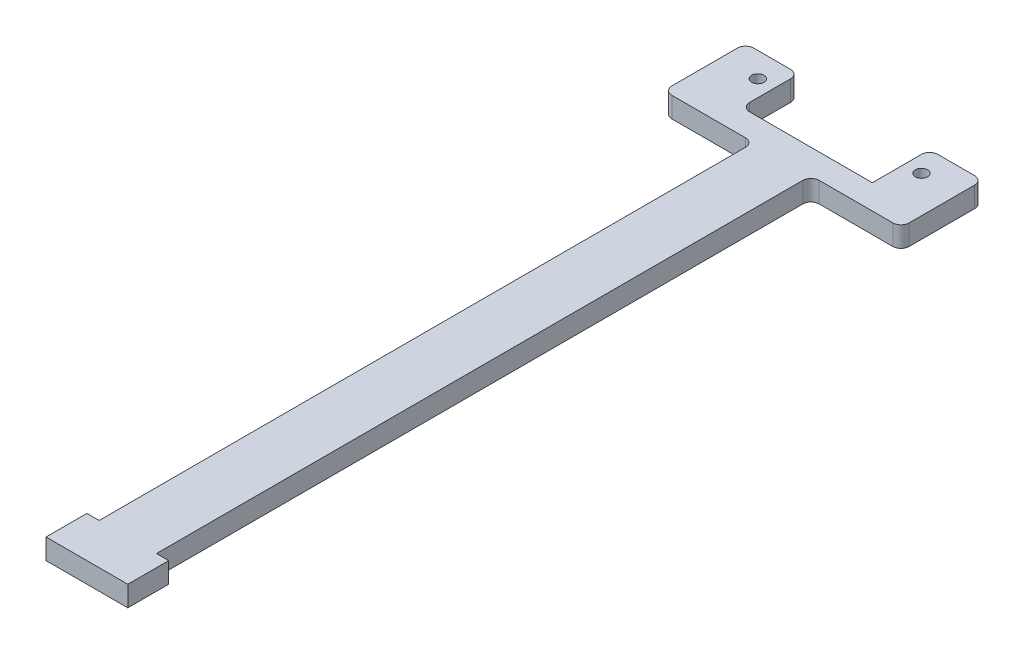
ISO-10303-21;
HEADER;
FILE_DESCRIPTION(('STEP AP214'),'2;1');
FILE_NAME('part.step','',(''),(''),'','','');
FILE_SCHEMA(('AUTOMOTIVE_DESIGN { 1 0 10303 214 1 1 1 1 }'));
ENDSEC;
DATA;
#1=APPLICATION_CONTEXT('core data for automotive mechanical design processes');
#2=APPLICATION_PROTOCOL_DEFINITION('international standard','automotive_design',2000,#1);
#3=PRODUCT_CONTEXT('',#1,'mechanical');
#4=PRODUCT('Part','Part','',(#3));
#5=PRODUCT_RELATED_PRODUCT_CATEGORY('part','',(#4));
#6=PRODUCT_DEFINITION_FORMATION('','',#4);
#7=PRODUCT_DEFINITION_CONTEXT('part definition',#1,'design');
#8=PRODUCT_DEFINITION('design','',#6,#7);
#9=PRODUCT_DEFINITION_SHAPE('','',#8);
#10=(LENGTH_UNIT() NAMED_UNIT(*) SI_UNIT(.MILLI.,.METRE.));
#11=(NAMED_UNIT(*) PLANE_ANGLE_UNIT() SI_UNIT($,.RADIAN.));
#12=(NAMED_UNIT(*) SI_UNIT($,.STERADIAN.) SOLID_ANGLE_UNIT());
#13=UNCERTAINTY_MEASURE_WITH_UNIT(LENGTH_MEASURE(1.E-05),#10,'distance_accuracy_value','');
#14=(GEOMETRIC_REPRESENTATION_CONTEXT(3) GLOBAL_UNCERTAINTY_ASSIGNED_CONTEXT((#13)) GLOBAL_UNIT_ASSIGNED_CONTEXT((#10,
#11,#12)) REPRESENTATION_CONTEXT('',''));
#15=CARTESIAN_POINT('',(0.,0.,0.));
#16=DIRECTION('',(0.,0.,1.));
#17=DIRECTION('',(1.,0.,0.));
#18=AXIS2_PLACEMENT_3D('',#15,#16,#17);
#19=CARTESIAN_POINT('',(28.,5.,-180.));
#20=DIRECTION('',(0.,0.,1.));
#21=DIRECTION('',(1.,0.,0.));
#22=AXIS2_PLACEMENT_3D('',#19,#20,#21);
#23=PLANE('',#22);
#24=DIRECTION('',(-1.,0.,0.));
#25=VECTOR('',#24,1.);
#26=CARTESIAN_POINT('',(28.,5.,-180.));
#27=LINE('',#26,#25);
#28=CARTESIAN_POINT('',(26.,5.,-180.));
#29=VERTEX_POINT('',#28);
#30=CARTESIAN_POINT('',(17.,5.,-180.));
#31=VERTEX_POINT('',#30);
#32=EDGE_CURVE('E264',#29,#31,#27,.T.);
#33=ORIENTED_EDGE('',*,*,#32,.F.);
#34=DIRECTION('',(0.,-1.,0.));
#35=VECTOR('',#34,1.);
#36=CARTESIAN_POINT('',(26.,5.,-180.));
#37=LINE('',#36,#35);
#38=CARTESIAN_POINT('',(26.,0.,-180.));
#39=VERTEX_POINT('',#38);
#40=EDGE_CURVE('E440',#29,#39,#37,.T.);
#41=ORIENTED_EDGE('',*,*,#40,.T.);
#42=DIRECTION('',(-1.,0.,0.));
#43=VECTOR('',#42,1.);
#44=CARTESIAN_POINT('',(28.,0.,-180.));
#45=LINE('',#44,#43);
#46=CARTESIAN_POINT('',(17.,0.,-180.));
#47=VERTEX_POINT('',#46);
#48=EDGE_CURVE('E311',#39,#47,#45,.T.);
#49=ORIENTED_EDGE('',*,*,#48,.T.);
#50=DIRECTION('',(0.,1.,0.));
#51=VECTOR('',#50,1.);
#52=CARTESIAN_POINT('',(17.,5.,-180.));
#53=LINE('',#52,#51);
#54=EDGE_CURVE('E437',#47,#31,#53,.T.);
#55=ORIENTED_EDGE('',*,*,#54,.T.);
#56=EDGE_LOOP('',(#33,#41,#49,#55));
#57=FACE_BOUND('',#56,.T.);
#58=ADVANCED_FACE('F39',(#57),#23,.F.);
#59=CARTESIAN_POINT('',(-11.,5.,10.));
#60=DIRECTION('',(0.,0.,-1.));
#61=DIRECTION('',(-1.,0.,0.));
#62=AXIS2_PLACEMENT_3D('',#59,#60,#61);
#63=PLANE('',#62);
#64=DIRECTION('',(1.,0.,0.));
#65=VECTOR('',#64,1.);
#66=CARTESIAN_POINT('',(-11.,0.,10.));
#67=LINE('',#66,#65);
#68=CARTESIAN_POINT('',(-11.,0.,10.));
#69=VERTEX_POINT('',#68);
#70=CARTESIAN_POINT('',(9.,0.,10.));
#71=VERTEX_POINT('',#70);
#72=EDGE_CURVE('E284',#69,#71,#67,.T.);
#73=ORIENTED_EDGE('',*,*,#72,.T.);
#74=DIRECTION('',(0.,-1.,0.));
#75=VECTOR('',#74,1.);
#76=CARTESIAN_POINT('',(9.,5.,10.));
#77=LINE('',#76,#75);
#78=CARTESIAN_POINT('',(9.,5.,10.));
#79=VERTEX_POINT('',#78);
#80=EDGE_CURVE('E347',#79,#71,#77,.T.);
#81=ORIENTED_EDGE('',*,*,#80,.F.);
#82=DIRECTION('',(1.,0.,0.));
#83=VECTOR('',#82,1.);
#84=CARTESIAN_POINT('',(-11.,5.,10.));
#85=LINE('',#84,#83);
#86=CARTESIAN_POINT('',(-11.,5.,10.));
#87=VERTEX_POINT('',#86);
#88=EDGE_CURVE('E241',#87,#79,#85,.T.);
#89=ORIENTED_EDGE('',*,*,#88,.F.);
#90=DIRECTION('',(0.,-1.,0.));
#91=VECTOR('',#90,1.);
#92=CARTESIAN_POINT('',(-11.,5.,10.));
#93=LINE('',#92,#91);
#94=EDGE_CURVE('E283',#87,#69,#93,.T.);
#95=ORIENTED_EDGE('',*,*,#94,.T.);
#96=EDGE_LOOP('',(#73,#81,#89,#95));
#97=FACE_BOUND('',#96,.T.);
#98=ADVANCED_FACE('F525',(#97),#63,.F.);
#99=CARTESIAN_POINT('',(9.,5.,10.));
#100=DIRECTION('',(-1.,0.,0.));
#101=DIRECTION('',(0.,0.,1.));
#102=AXIS2_PLACEMENT_3D('',#99,#100,#101);
#103=PLANE('',#102);
#104=DIRECTION('',(0.,0.,-1.));
#105=VECTOR('',#104,1.);
#106=CARTESIAN_POINT('',(9.,0.,10.));
#107=LINE('',#106,#105);
#108=CARTESIAN_POINT('',(9.,0.,0.));
#109=VERTEX_POINT('',#108);
#110=EDGE_CURVE('E288',#71,#109,#107,.T.);
#111=ORIENTED_EDGE('',*,*,#110,.T.);
#112=DIRECTION('',(0.,-1.,0.));
#113=VECTOR('',#112,1.);
#114=CARTESIAN_POINT('',(9.,5.,0.));
#115=LINE('',#114,#113);
#116=CARTESIAN_POINT('',(9.,5.,0.));
#117=VERTEX_POINT('',#116);
#118=EDGE_CURVE('E343',#117,#109,#115,.T.);
#119=ORIENTED_EDGE('',*,*,#118,.F.);
#120=DIRECTION('',(0.,0.,-1.));
#121=VECTOR('',#120,1.);
#122=CARTESIAN_POINT('',(9.,5.,10.));
#123=LINE('',#122,#121);
#124=EDGE_CURVE('E245',#79,#117,#123,.T.);
#125=ORIENTED_EDGE('',*,*,#124,.F.);
#126=ORIENTED_EDGE('',*,*,#80,.T.);
#127=EDGE_LOOP('',(#111,#119,#125,#126));
#128=FACE_BOUND('',#127,.T.);
#129=ADVANCED_FACE('F531',(#128),#103,.F.);
#130=CARTESIAN_POINT('',(9.,5.,0.));
#131=DIRECTION('',(0.,0.,1.));
#132=DIRECTION('',(1.,0.,0.));
#133=AXIS2_PLACEMENT_3D('',#130,#131,#132);
#134=PLANE('',#133);
#135=DIRECTION('',(-1.,0.,0.));
#136=VECTOR('',#135,1.);
#137=CARTESIAN_POINT('',(9.,0.,0.));
#138=LINE('',#137,#136);
#139=CARTESIAN_POINT('',(6.,0.,0.));
#140=VERTEX_POINT('',#139);
#141=EDGE_CURVE('E292',#109,#140,#138,.T.);
#142=ORIENTED_EDGE('',*,*,#141,.T.);
#143=DIRECTION('',(0.,-1.,0.));
#144=VECTOR('',#143,1.);
#145=CARTESIAN_POINT('',(6.,5.,0.));
#146=LINE('',#145,#144);
#147=CARTESIAN_POINT('',(6.,5.,0.));
#148=VERTEX_POINT('',#147);
#149=EDGE_CURVE('E339',#148,#140,#146,.T.);
#150=ORIENTED_EDGE('',*,*,#149,.F.);
#151=DIRECTION('',(-1.,0.,0.));
#152=VECTOR('',#151,1.);
#153=CARTESIAN_POINT('',(9.,5.,0.));
#154=LINE('',#153,#152);
#155=EDGE_CURVE('E249',#117,#148,#154,.T.);
#156=ORIENTED_EDGE('',*,*,#155,.F.);
#157=ORIENTED_EDGE('',*,*,#118,.T.);
#158=EDGE_LOOP('',(#142,#150,#156,#157));
#159=FACE_BOUND('',#158,.T.);
#160=ADVANCED_FACE('F557',(#159),#134,.F.);
#161=CARTESIAN_POINT('',(6.,5.,0.));
#162=DIRECTION('',(-1.,0.,0.));
#163=DIRECTION('',(0.,0.,1.));
#164=AXIS2_PLACEMENT_3D('',#161,#162,#163);
#165=PLANE('',#164);
#166=DIRECTION('',(0.,0.,-1.));
#167=VECTOR('',#166,1.);
#168=CARTESIAN_POINT('',(6.,0.,0.));
#169=LINE('',#168,#167);
#170=CARTESIAN_POINT('',(6.00000000000001,0.,-158.));
#171=VERTEX_POINT('',#170);
#172=EDGE_CURVE('E295',#140,#171,#169,.T.);
#173=ORIENTED_EDGE('',*,*,#172,.T.);
#174=DIRECTION('',(0.,-1.,0.));
#175=VECTOR('',#174,1.);
#176=CARTESIAN_POINT('',(6.00000000000001,5.,-158.));
#177=LINE('',#176,#175);
#178=CARTESIAN_POINT('',(6.00000000000001,5.,-158.));
#179=VERTEX_POINT('',#178);
#180=EDGE_CURVE('E375',#171,#179,#177,.F.);
#181=ORIENTED_EDGE('',*,*,#180,.T.);
#182=DIRECTION('',(0.,0.,-1.));
#183=VECTOR('',#182,1.);
#184=CARTESIAN_POINT('',(6.,5.,0.));
#185=LINE('',#184,#183);
#186=EDGE_CURVE('E252',#148,#179,#185,.T.);
#187=ORIENTED_EDGE('',*,*,#186,.F.);
#188=ORIENTED_EDGE('',*,*,#149,.T.);
#189=EDGE_LOOP('',(#173,#181,#187,#188));
#190=FACE_BOUND('',#189,.T.);
#191=ADVANCED_FACE('F550',(#190),#165,.F.);
#192=CARTESIAN_POINT('',(6.00000000000001,5.,-160.));
#193=DIRECTION('',(0.,0.,-1.));
#194=DIRECTION('',(-1.,0.,0.));
#195=AXIS2_PLACEMENT_3D('',#192,#193,#194);
#196=PLANE('',#195);
#197=DIRECTION('',(1.,0.,0.));
#198=VECTOR('',#197,1.);
#199=CARTESIAN_POINT('',(6.00000000000001,5.,-160.));
#200=LINE('',#199,#198);
#201=CARTESIAN_POINT('',(8.00000000000001,5.,-160.));
#202=VERTEX_POINT('',#201);
#203=CARTESIAN_POINT('',(26.,5.,-160.));
#204=VERTEX_POINT('',#203);
#205=EDGE_CURVE('E256',#202,#204,#200,.T.);
#206=ORIENTED_EDGE('',*,*,#205,.F.);
#207=DIRECTION('',(0.,-1.,0.));
#208=VECTOR('',#207,1.);
#209=CARTESIAN_POINT('',(8.00000000000001,0.,-160.));
#210=LINE('',#209,#208);
#211=CARTESIAN_POINT('',(8.00000000000001,0.,-160.));
#212=VERTEX_POINT('',#211);
#213=EDGE_CURVE('E371',#202,#212,#210,.T.);
#214=ORIENTED_EDGE('',*,*,#213,.T.);
#215=DIRECTION('',(1.,0.,0.));
#216=VECTOR('',#215,1.);
#217=CARTESIAN_POINT('',(6.00000000000001,0.,-160.));
#218=LINE('',#217,#216);
#219=CARTESIAN_POINT('',(26.,0.,-160.));
#220=VERTEX_POINT('',#219);
#221=EDGE_CURVE('E299',#212,#220,#218,.T.);
#222=ORIENTED_EDGE('',*,*,#221,.T.);
#223=DIRECTION('',(0.,-1.,0.));
#224=VECTOR('',#223,1.);
#225=CARTESIAN_POINT('',(26.,5.,-160.));
#226=LINE('',#225,#224);
#227=EDGE_CURVE('E360',#220,#204,#226,.F.);
#228=ORIENTED_EDGE('',*,*,#227,.T.);
#229=EDGE_LOOP('',(#206,#214,#222,#228));
#230=FACE_BOUND('',#229,.T.);
#231=ADVANCED_FACE('F545',(#230),#196,.F.);
#232=CARTESIAN_POINT('',(28.,5.,-160.));
#233=DIRECTION('',(-1.,0.,0.));
#234=DIRECTION('',(0.,0.,1.));
#235=AXIS2_PLACEMENT_3D('',#232,#233,#234);
#236=PLANE('',#235);
#237=DIRECTION('',(0.,0.,-1.));
#238=VECTOR('',#237,1.);
#239=CARTESIAN_POINT('',(28.,5.,-160.));
#240=LINE('',#239,#238);
#241=CARTESIAN_POINT('',(28.,5.,-162.));
#242=VERTEX_POINT('',#241);
#243=CARTESIAN_POINT('',(28.,5.,-178.));
#244=VERTEX_POINT('',#243);
#245=EDGE_CURVE('E260',#242,#244,#240,.T.);
#246=ORIENTED_EDGE('',*,*,#245,.F.);
#247=DIRECTION('',(0.,-1.,0.));
#248=VECTOR('',#247,1.);
#249=CARTESIAN_POINT('',(28.,5.,-162.));
#250=LINE('',#249,#248);
#251=CARTESIAN_POINT('',(28.,0.,-162.));
#252=VERTEX_POINT('',#251);
#253=EDGE_CURVE('E433',#242,#252,#250,.T.);
#254=ORIENTED_EDGE('',*,*,#253,.T.);
#255=DIRECTION('',(0.,0.,-1.));
#256=VECTOR('',#255,1.);
#257=CARTESIAN_POINT('',(28.,0.,-160.));
#258=LINE('',#257,#256);
#259=CARTESIAN_POINT('',(28.,0.,-178.));
#260=VERTEX_POINT('',#259);
#261=EDGE_CURVE('E303',#252,#260,#258,.T.);
#262=ORIENTED_EDGE('',*,*,#261,.T.);
#263=DIRECTION('',(0.,-1.,0.));
#264=VECTOR('',#263,1.);
#265=CARTESIAN_POINT('',(28.,5.,-178.));
#266=LINE('',#265,#264);
#267=EDGE_CURVE('E430',#260,#244,#266,.F.);
#268=ORIENTED_EDGE('',*,*,#267,.T.);
#269=EDGE_LOOP('',(#246,#254,#262,#268));
#270=FACE_BOUND('',#269,.T.);
#271=ADVANCED_FACE('F538',(#270),#236,.F.);
#272=CARTESIAN_POINT('',(-19.,5.,-180.));
#273=VERTEX_POINT('',#272);
#274=CARTESIAN_POINT('',(-28.,5.,-180.));
#275=VERTEX_POINT('',#274);
#276=EDGE_CURVE('E263',#273,#275,#27,.T.);
#277=ORIENTED_EDGE('',*,*,#276,.F.);
#278=DIRECTION('',(0.,1.,0.));
#279=VECTOR('',#278,1.);
#280=CARTESIAN_POINT('',(-19.,5.,-180.));
#281=LINE('',#280,#279);
#282=CARTESIAN_POINT('',(-19.,0.,-180.));
#283=VERTEX_POINT('',#282);
#284=EDGE_CURVE('E459',#273,#283,#281,.F.);
#285=ORIENTED_EDGE('',*,*,#284,.T.);
#286=CARTESIAN_POINT('',(-28.,0.,-180.));
#287=VERTEX_POINT('',#286);
#288=EDGE_CURVE('E307',#283,#287,#45,.T.);
#289=ORIENTED_EDGE('',*,*,#288,.T.);
#290=DIRECTION('',(0.,-1.,0.));
#291=VECTOR('',#290,1.);
#292=CARTESIAN_POINT('',(-28.,5.,-180.));
#293=LINE('',#292,#291);
#294=EDGE_CURVE('E456',#287,#275,#293,.F.);
#295=ORIENTED_EDGE('',*,*,#294,.T.);
#296=EDGE_LOOP('',(#277,#285,#289,#295));
#297=FACE_BOUND('',#296,.T.);
#298=ADVANCED_FACE('F495',(#297),#23,.F.);
#299=CARTESIAN_POINT('',(-30.,5.,-180.));
#300=DIRECTION('',(1.,0.,0.));
#301=DIRECTION('',(0.,0.,-1.));
#302=AXIS2_PLACEMENT_3D('',#299,#300,#301);
#303=PLANE('',#302);
#304=DIRECTION('',(0.,0.,1.));
#305=VECTOR('',#304,1.);
#306=CARTESIAN_POINT('',(-30.,0.,-180.));
#307=LINE('',#306,#305);
#308=CARTESIAN_POINT('',(-30.,0.,-178.));
#309=VERTEX_POINT('',#308);
#310=CARTESIAN_POINT('',(-30.,0.,-162.));
#311=VERTEX_POINT('',#310);
#312=EDGE_CURVE('E312',#309,#311,#307,.T.);
#313=ORIENTED_EDGE('',*,*,#312,.T.);
#314=DIRECTION('',(0.,-1.,0.));
#315=VECTOR('',#314,1.);
#316=CARTESIAN_POINT('',(-30.,5.,-162.));
#317=LINE('',#316,#315);
#318=CARTESIAN_POINT('',(-30.,5.,-162.));
#319=VERTEX_POINT('',#318);
#320=EDGE_CURVE('E411',#311,#319,#317,.F.);
#321=ORIENTED_EDGE('',*,*,#320,.T.);
#322=DIRECTION('',(0.,0.,1.));
#323=VECTOR('',#322,1.);
#324=CARTESIAN_POINT('',(-30.,5.,-180.));
#325=LINE('',#324,#323);
#326=CARTESIAN_POINT('',(-30.,5.,-178.));
#327=VERTEX_POINT('',#326);
#328=EDGE_CURVE('E267',#327,#319,#325,.T.);
#329=ORIENTED_EDGE('',*,*,#328,.F.);
#330=DIRECTION('',(0.,-1.,0.));
#331=VECTOR('',#330,1.);
#332=CARTESIAN_POINT('',(-30.,5.,-178.));
#333=LINE('',#332,#331);
#334=EDGE_CURVE('E407',#327,#309,#333,.T.);
#335=ORIENTED_EDGE('',*,*,#334,.T.);
#336=EDGE_LOOP('',(#313,#321,#329,#335));
#337=FACE_BOUND('',#336,.T.);
#338=ADVANCED_FACE('F537',(#337),#303,.F.);
#339=CARTESIAN_POINT('',(-30.,5.,-160.));
#340=DIRECTION('',(0.,0.,-1.));
#341=DIRECTION('',(-1.,0.,0.));
#342=AXIS2_PLACEMENT_3D('',#339,#340,#341);
#343=PLANE('',#342);
#344=DIRECTION('',(1.,0.,0.));
#345=VECTOR('',#344,1.);
#346=CARTESIAN_POINT('',(-30.,0.,-160.));
#347=LINE('',#346,#345);
#348=CARTESIAN_POINT('',(-28.,0.,-160.));
#349=VERTEX_POINT('',#348);
#350=CARTESIAN_POINT('',(-10.,0.,-160.));
#351=VERTEX_POINT('',#350);
#352=EDGE_CURVE('E316',#349,#351,#347,.T.);
#353=ORIENTED_EDGE('',*,*,#352,.T.);
#354=DIRECTION('',(0.,-1.,0.));
#355=VECTOR('',#354,1.);
#356=CARTESIAN_POINT('',(-10.,5.,-160.));
#357=LINE('',#356,#355);
#358=CARTESIAN_POINT('',(-10.,5.,-160.));
#359=VERTEX_POINT('',#358);
#360=EDGE_CURVE('E386',#351,#359,#357,.F.);
#361=ORIENTED_EDGE('',*,*,#360,.T.);
#362=DIRECTION('',(1.,0.,0.));
#363=VECTOR('',#362,1.);
#364=CARTESIAN_POINT('',(-30.,5.,-160.));
#365=LINE('',#364,#363);
#366=CARTESIAN_POINT('',(-28.,5.,-160.));
#367=VERTEX_POINT('',#366);
#368=EDGE_CURVE('E270',#367,#359,#365,.T.);
#369=ORIENTED_EDGE('',*,*,#368,.F.);
#370=DIRECTION('',(0.,-1.,0.));
#371=VECTOR('',#370,1.);
#372=CARTESIAN_POINT('',(-28.,5.,-160.));
#373=LINE('',#372,#371);
#374=EDGE_CURVE('E382',#367,#349,#373,.T.);
#375=ORIENTED_EDGE('',*,*,#374,.T.);
#376=EDGE_LOOP('',(#353,#361,#369,#375));
#377=FACE_BOUND('',#376,.T.);
#378=ADVANCED_FACE('F543',(#377),#343,.F.);
#379=CARTESIAN_POINT('',(-8.00000000000002,5.,-160.));
#380=DIRECTION('',(1.,0.,0.));
#381=DIRECTION('',(0.,0.,-1.));
#382=AXIS2_PLACEMENT_3D('',#379,#380,#381);
#383=PLANE('',#382);
#384=DIRECTION('',(0.,0.,1.));
#385=VECTOR('',#384,1.);
#386=CARTESIAN_POINT('',(-8.00000000000002,5.,-160.));
#387=LINE('',#386,#385);
#388=CARTESIAN_POINT('',(-8.00000000000002,5.,-158.));
#389=VERTEX_POINT('',#388);
#390=CARTESIAN_POINT('',(-8.,5.,0.));
#391=VERTEX_POINT('',#390);
#392=EDGE_CURVE('E274',#389,#391,#387,.T.);
#393=ORIENTED_EDGE('',*,*,#392,.F.);
#394=DIRECTION('',(0.,-1.,0.));
#395=VECTOR('',#394,1.);
#396=CARTESIAN_POINT('',(-8.00000000000002,0.,-158.));
#397=LINE('',#396,#395);
#398=CARTESIAN_POINT('',(-8.00000000000002,0.,-158.));
#399=VERTEX_POINT('',#398);
#400=EDGE_CURVE('E378',#389,#399,#397,.T.);
#401=ORIENTED_EDGE('',*,*,#400,.T.);
#402=DIRECTION('',(0.,0.,1.));
#403=VECTOR('',#402,1.);
#404=CARTESIAN_POINT('',(-8.00000000000002,0.,-160.));
#405=LINE('',#404,#403);
#406=CARTESIAN_POINT('',(-8.,0.,0.));
#407=VERTEX_POINT('',#406);
#408=EDGE_CURVE('E320',#399,#407,#405,.T.);
#409=ORIENTED_EDGE('',*,*,#408,.T.);
#410=DIRECTION('',(0.,-1.,0.));
#411=VECTOR('',#410,1.);
#412=CARTESIAN_POINT('',(-8.,5.,0.));
#413=LINE('',#412,#411);
#414=EDGE_CURVE('E335',#391,#407,#413,.T.);
#415=ORIENTED_EDGE('',*,*,#414,.F.);
#416=EDGE_LOOP('',(#393,#401,#409,#415));
#417=FACE_BOUND('',#416,.T.);
#418=ADVANCED_FACE('F611',(#417),#383,.F.);
#419=CARTESIAN_POINT('',(-8.,5.,0.));
#420=DIRECTION('',(0.,0.,1.));
#421=DIRECTION('',(1.,0.,0.));
#422=AXIS2_PLACEMENT_3D('',#419,#420,#421);
#423=PLANE('',#422);
#424=DIRECTION('',(-1.,0.,0.));
#425=VECTOR('',#424,1.);
#426=CARTESIAN_POINT('',(-8.,0.,0.));
#427=LINE('',#426,#425);
#428=CARTESIAN_POINT('',(-11.,0.,0.));
#429=VERTEX_POINT('',#428);
#430=EDGE_CURVE('E323',#407,#429,#427,.T.);
#431=ORIENTED_EDGE('',*,*,#430,.T.);
#432=DIRECTION('',(0.,-1.,0.));
#433=VECTOR('',#432,1.);
#434=CARTESIAN_POINT('',(-11.,5.,0.));
#435=LINE('',#434,#433);
#436=CARTESIAN_POINT('',(-11.,5.,0.));
#437=VERTEX_POINT('',#436);
#438=EDGE_CURVE('E331',#437,#429,#435,.T.);
#439=ORIENTED_EDGE('',*,*,#438,.F.);
#440=DIRECTION('',(-1.,0.,0.));
#441=VECTOR('',#440,1.);
#442=CARTESIAN_POINT('',(-8.,5.,0.));
#443=LINE('',#442,#441);
#444=EDGE_CURVE('E277',#391,#437,#443,.T.);
#445=ORIENTED_EDGE('',*,*,#444,.F.);
#446=ORIENTED_EDGE('',*,*,#414,.T.);
#447=EDGE_LOOP('',(#431,#439,#445,#446));
#448=FACE_BOUND('',#447,.T.);
#449=ADVANCED_FACE('F519',(#448),#423,.F.);
#450=CARTESIAN_POINT('',(-11.,5.,0.));
#451=DIRECTION('',(1.,0.,0.));
#452=DIRECTION('',(0.,0.,-1.));
#453=AXIS2_PLACEMENT_3D('',#450,#451,#452);
#454=PLANE('',#453);
#455=DIRECTION('',(0.,0.,1.));
#456=VECTOR('',#455,1.);
#457=CARTESIAN_POINT('',(-11.,0.,0.));
#458=LINE('',#457,#456);
#459=EDGE_CURVE('E246',#429,#69,#458,.T.);
#460=ORIENTED_EDGE('',*,*,#459,.T.);
#461=ORIENTED_EDGE('',*,*,#94,.F.);
#462=DIRECTION('',(0.,0.,1.));
#463=VECTOR('',#462,1.);
#464=CARTESIAN_POINT('',(-11.,5.,0.));
#465=LINE('',#464,#463);
#466=EDGE_CURVE('E280',#437,#87,#465,.T.);
#467=ORIENTED_EDGE('',*,*,#466,.F.);
#468=ORIENTED_EDGE('',*,*,#438,.T.);
#469=EDGE_LOOP('',(#460,#461,#467,#468));
#470=FACE_BOUND('',#469,.T.);
#471=ADVANCED_FACE('F510',(#470),#454,.F.);
#472=CARTESIAN_POINT('',(0.,5.,0.));
#473=DIRECTION('',(0.,1.,0.));
#474=DIRECTION('',(0.,0.,1.));
#475=AXIS2_PLACEMENT_3D('',#472,#473,#474);
#476=PLANE('',#475);
#477=CARTESIAN_POINT('',(-21.,5.,-174.));
#478=DIRECTION('',(0.,1.,0.));
#479=DIRECTION('',(0.,0.,1.));
#480=AXIS2_PLACEMENT_3D('',#477,#478,#479);
#481=CIRCLE('',#480,1.5);
#482=CARTESIAN_POINT('',(-21.,5.,-172.5));
#483=VERTEX_POINT('',#482);
#484=EDGE_CURVE('E365',#483,#483,#481,.T.);
#485=ORIENTED_EDGE('',*,*,#484,.F.);
#486=EDGE_LOOP('',(#485));
#487=FACE_BOUND('',#486,.T.);
#488=CARTESIAN_POINT('',(19.,5.,-174.));
#489=DIRECTION('',(0.,1.,0.));
#490=DIRECTION('',(0.,0.,1.));
#491=AXIS2_PLACEMENT_3D('',#488,#489,#490);
#492=CIRCLE('',#491,1.5);
#493=CARTESIAN_POINT('',(19.,5.,-172.5));
#494=VERTEX_POINT('',#493);
#495=EDGE_CURVE('E229',#494,#494,#492,.T.);
#496=ORIENTED_EDGE('',*,*,#495,.F.);
#497=EDGE_LOOP('',(#496));
#498=FACE_BOUND('',#497,.T.);
#499=ORIENTED_EDGE('',*,*,#328,.T.);
#500=CARTESIAN_POINT('',(-28.,5.,-162.));
#501=DIRECTION('',(0.,1.,0.));
#502=DIRECTION('',(0.,0.,1.));
#503=AXIS2_PLACEMENT_3D('',#500,#501,#502);
#504=CIRCLE('',#503,2.);
#505=EDGE_CURVE('E427',#319,#367,#504,.T.);
#506=ORIENTED_EDGE('',*,*,#505,.T.);
#507=ORIENTED_EDGE('',*,*,#368,.T.);
#508=CARTESIAN_POINT('',(-10.,5.,-158.));
#509=DIRECTION('',(0.,1.,0.));
#510=DIRECTION('',(0.,0.,1.));
#511=AXIS2_PLACEMENT_3D('',#508,#509,#510);
#512=CIRCLE('',#511,2.);
#513=EDGE_CURVE('E471',#359,#389,#512,.F.);
#514=ORIENTED_EDGE('',*,*,#513,.T.);
#515=ORIENTED_EDGE('',*,*,#392,.T.);
#516=ORIENTED_EDGE('',*,*,#444,.T.);
#517=ORIENTED_EDGE('',*,*,#466,.T.);
#518=ORIENTED_EDGE('',*,*,#88,.T.);
#519=ORIENTED_EDGE('',*,*,#124,.T.);
#520=ORIENTED_EDGE('',*,*,#155,.T.);
#521=ORIENTED_EDGE('',*,*,#186,.T.);
#522=CARTESIAN_POINT('',(8.00000000000001,5.,-158.));
#523=DIRECTION('',(0.,1.,0.));
#524=DIRECTION('',(0.,0.,1.));
#525=AXIS2_PLACEMENT_3D('',#522,#523,#524);
#526=CIRCLE('',#525,2.);
#527=EDGE_CURVE('E465',#179,#202,#526,.F.);
#528=ORIENTED_EDGE('',*,*,#527,.T.);
#529=ORIENTED_EDGE('',*,*,#205,.T.);
#530=CARTESIAN_POINT('',(26.,5.,-162.));
#531=DIRECTION('',(0.,1.,0.));
#532=DIRECTION('',(0.,0.,1.));
#533=AXIS2_PLACEMENT_3D('',#530,#531,#532);
#534=CIRCLE('',#533,2.);
#535=EDGE_CURVE('E424',#204,#242,#534,.T.);
#536=ORIENTED_EDGE('',*,*,#535,.T.);
#537=ORIENTED_EDGE('',*,*,#245,.T.);
#538=CARTESIAN_POINT('',(26.,5.,-178.));
#539=DIRECTION('',(0.,1.,0.));
#540=DIRECTION('',(0.,0.,1.));
#541=AXIS2_PLACEMENT_3D('',#538,#539,#540);
#542=CIRCLE('',#541,2.);
#543=EDGE_CURVE('E63',#244,#29,#542,.T.);
#544=ORIENTED_EDGE('',*,*,#543,.T.);
#545=ORIENTED_EDGE('',*,*,#32,.T.);
#546=CARTESIAN_POINT('',(17.,5.,-178.));
#547=DIRECTION('',(0.,1.,0.));
#548=DIRECTION('',(0.,0.,1.));
#549=AXIS2_PLACEMENT_3D('',#546,#547,#548);
#550=CIRCLE('',#549,2.);
#551=CARTESIAN_POINT('',(15.,5.,-178.));
#552=VERTEX_POINT('',#551);
#553=EDGE_CURVE('E55',#31,#552,#550,.T.);
#554=ORIENTED_EDGE('',*,*,#553,.T.);
#555=DIRECTION('',(0.,0.,-1.));
#556=VECTOR('',#555,1.);
#557=CARTESIAN_POINT('',(15.,5.,-166.));
#558=LINE('',#557,#556);
#559=CARTESIAN_POINT('',(15.,5.,-166.));
#560=VERTEX_POINT('',#559);
#561=EDGE_CURVE('E225',#560,#552,#558,.T.);
#562=ORIENTED_EDGE('',*,*,#561,.F.);
#563=DIRECTION('',(1.,0.,0.));
#564=VECTOR('',#563,1.);
#565=CARTESIAN_POINT('',(-17.,5.,-166.));
#566=LINE('',#565,#564);
#567=CARTESIAN_POINT('',(-15.,5.,-166.));
#568=VERTEX_POINT('',#567);
#569=EDGE_CURVE('E210',#568,#560,#566,.T.);
#570=ORIENTED_EDGE('',*,*,#569,.F.);
#571=CARTESIAN_POINT('',(-15.,5.,-168.));
#572=DIRECTION('',(0.,1.,0.));
#573=DIRECTION('',(0.,0.,1.));
#574=AXIS2_PLACEMENT_3D('',#571,#572,#573);
#575=CIRCLE('',#574,2.);
#576=CARTESIAN_POINT('',(-17.,5.,-168.));
#577=VERTEX_POINT('',#576);
#578=EDGE_CURVE('E48',#568,#577,#575,.F.);
#579=ORIENTED_EDGE('',*,*,#578,.T.);
#580=DIRECTION('',(0.,0.,1.));
#581=VECTOR('',#580,1.);
#582=CARTESIAN_POINT('',(-17.,5.,-180.));
#583=LINE('',#582,#581);
#584=CARTESIAN_POINT('',(-17.,5.,-178.));
#585=VERTEX_POINT('',#584);
#586=EDGE_CURVE('E219',#585,#577,#583,.T.);
#587=ORIENTED_EDGE('',*,*,#586,.F.);
#588=CARTESIAN_POINT('',(-19.,5.,-178.));
#589=DIRECTION('',(0.,1.,0.));
#590=DIRECTION('',(0.,0.,1.));
#591=AXIS2_PLACEMENT_3D('',#588,#589,#590);
#592=CIRCLE('',#591,2.);
#593=EDGE_CURVE('E417',#585,#273,#592,.T.);
#594=ORIENTED_EDGE('',*,*,#593,.T.);
#595=ORIENTED_EDGE('',*,*,#276,.T.);
#596=CARTESIAN_POINT('',(-28.,5.,-178.));
#597=DIRECTION('',(0.,1.,0.));
#598=DIRECTION('',(0.,0.,1.));
#599=AXIS2_PLACEMENT_3D('',#596,#597,#598);
#600=CIRCLE('',#599,2.);
#601=EDGE_CURVE('E414',#275,#327,#600,.T.);
#602=ORIENTED_EDGE('',*,*,#601,.T.);
#603=EDGE_LOOP('',(#499,#506,#507,#514,#515,#516,#517,#518,#519,#520,#521,#528,#529,#536,#537,
#544,#545,#554,#562,#570,#579,#587,#594,#595,#602));
#604=FACE_BOUND('',#603,.T.);
#605=ADVANCED_FACE('F232',(#487,#498,#604),#476,.T.);
#606=CARTESIAN_POINT('',(0.,0.,0.));
#607=DIRECTION('',(0.,1.,0.));
#608=DIRECTION('',(0.,0.,1.));
#609=AXIS2_PLACEMENT_3D('',#606,#607,#608);
#610=PLANE('',#609);
#611=CARTESIAN_POINT('',(-21.,0.,-174.));
#612=DIRECTION('',(0.,1.,0.));
#613=DIRECTION('',(0.,0.,1.));
#614=AXIS2_PLACEMENT_3D('',#611,#612,#613);
#615=CIRCLE('',#614,1.5);
#616=CARTESIAN_POINT('',(-21.,0.,-172.5));
#617=VERTEX_POINT('',#616);
#618=EDGE_CURVE('E289',#617,#617,#615,.T.);
#619=ORIENTED_EDGE('',*,*,#618,.T.);
#620=EDGE_LOOP('',(#619));
#621=FACE_BOUND('',#620,.T.);
#622=CARTESIAN_POINT('',(19.,0.,-174.));
#623=DIRECTION('',(0.,1.,0.));
#624=DIRECTION('',(0.,0.,1.));
#625=AXIS2_PLACEMENT_3D('',#622,#623,#624);
#626=CIRCLE('',#625,1.5);
#627=CARTESIAN_POINT('',(19.,0.,-172.5));
#628=VERTEX_POINT('',#627);
#629=EDGE_CURVE('E361',#628,#628,#626,.T.);
#630=ORIENTED_EDGE('',*,*,#629,.T.);
#631=EDGE_LOOP('',(#630));
#632=FACE_BOUND('',#631,.T.);
#633=ORIENTED_EDGE('',*,*,#352,.F.);
#634=CARTESIAN_POINT('',(-28.,0.,-162.));
#635=DIRECTION('',(0.,1.,0.));
#636=DIRECTION('',(0.,0.,1.));
#637=AXIS2_PLACEMENT_3D('',#634,#635,#636);
#638=CIRCLE('',#637,2.);
#639=EDGE_CURVE('E404',#349,#311,#638,.F.);
#640=ORIENTED_EDGE('',*,*,#639,.T.);
#641=ORIENTED_EDGE('',*,*,#312,.F.);
#642=CARTESIAN_POINT('',(-28.,0.,-178.));
#643=DIRECTION('',(0.,1.,0.));
#644=DIRECTION('',(0.,0.,1.));
#645=AXIS2_PLACEMENT_3D('',#642,#643,#644);
#646=CIRCLE('',#645,2.);
#647=EDGE_CURVE('E389',#309,#287,#646,.F.);
#648=ORIENTED_EDGE('',*,*,#647,.T.);
#649=ORIENTED_EDGE('',*,*,#288,.F.);
#650=CARTESIAN_POINT('',(-19.,0.,-178.));
#651=DIRECTION('',(0.,1.,0.));
#652=DIRECTION('',(0.,0.,1.));
#653=AXIS2_PLACEMENT_3D('',#650,#651,#652);
#654=CIRCLE('',#653,2.);
#655=CARTESIAN_POINT('',(-17.,0.,-178.));
#656=VERTEX_POINT('',#655);
#657=EDGE_CURVE('E392',#283,#656,#654,.F.);
#658=ORIENTED_EDGE('',*,*,#657,.T.);
#659=DIRECTION('',(0.,0.,1.));
#660=VECTOR('',#659,1.);
#661=CARTESIAN_POINT('',(-16.9999999999999,0.,0.));
#662=LINE('',#661,#660);
#663=CARTESIAN_POINT('',(-17.,0.,-168.));
#664=VERTEX_POINT('',#663);
#665=EDGE_CURVE('E351',#656,#664,#662,.T.);
#666=ORIENTED_EDGE('',*,*,#665,.T.);
#667=CARTESIAN_POINT('',(-15.,0.,-168.));
#668=DIRECTION('',(0.,1.,0.));
#669=DIRECTION('',(0.,0.,1.));
#670=AXIS2_PLACEMENT_3D('',#667,#668,#669);
#671=CIRCLE('',#670,2.);
#672=CARTESIAN_POINT('',(-15.,0.,-166.));
#673=VERTEX_POINT('',#672);
#674=EDGE_CURVE('E11',#664,#673,#671,.T.);
#675=ORIENTED_EDGE('',*,*,#674,.T.);
#676=DIRECTION('',(1.,0.,0.));
#677=VECTOR('',#676,1.);
#678=CARTESIAN_POINT('',(0.,0.,-166.));
#679=LINE('',#678,#677);
#680=CARTESIAN_POINT('',(15.,0.,-166.));
#681=VERTEX_POINT('',#680);
#682=EDGE_CURVE('E355',#673,#681,#679,.T.);
#683=ORIENTED_EDGE('',*,*,#682,.T.);
#684=DIRECTION('',(0.,0.,-1.));
#685=VECTOR('',#684,1.);
#686=CARTESIAN_POINT('',(15.0000000000001,0.,0.));
#687=LINE('',#686,#685);
#688=CARTESIAN_POINT('',(15.,0.,-178.));
#689=VERTEX_POINT('',#688);
#690=EDGE_CURVE('E227',#681,#689,#687,.T.);
#691=ORIENTED_EDGE('',*,*,#690,.T.);
#692=CARTESIAN_POINT('',(17.,0.,-178.));
#693=DIRECTION('',(0.,1.,0.));
#694=DIRECTION('',(0.,0.,1.));
#695=AXIS2_PLACEMENT_3D('',#692,#693,#694);
#696=CIRCLE('',#695,2.);
#697=EDGE_CURVE('E395',#689,#47,#696,.F.);
#698=ORIENTED_EDGE('',*,*,#697,.T.);
#699=ORIENTED_EDGE('',*,*,#48,.F.);
#700=CARTESIAN_POINT('',(26.,0.,-178.));
#701=DIRECTION('',(0.,1.,0.));
#702=DIRECTION('',(0.,0.,1.));
#703=AXIS2_PLACEMENT_3D('',#700,#701,#702);
#704=CIRCLE('',#703,2.);
#705=EDGE_CURVE('E398',#39,#260,#704,.F.);
#706=ORIENTED_EDGE('',*,*,#705,.T.);
#707=ORIENTED_EDGE('',*,*,#261,.F.);
#708=CARTESIAN_POINT('',(26.,0.,-162.));
#709=DIRECTION('',(0.,1.,0.));
#710=DIRECTION('',(0.,0.,1.));
#711=AXIS2_PLACEMENT_3D('',#708,#709,#710);
#712=CIRCLE('',#711,2.);
#713=EDGE_CURVE('E401',#252,#220,#712,.F.);
#714=ORIENTED_EDGE('',*,*,#713,.T.);
#715=ORIENTED_EDGE('',*,*,#221,.F.);
#716=CARTESIAN_POINT('',(8.00000000000001,0.,-158.));
#717=DIRECTION('',(0.,1.,0.));
#718=DIRECTION('',(0.,0.,1.));
#719=AXIS2_PLACEMENT_3D('',#716,#717,#718);
#720=CIRCLE('',#719,2.);
#721=EDGE_CURVE('E462',#212,#171,#720,.T.);
#722=ORIENTED_EDGE('',*,*,#721,.T.);
#723=ORIENTED_EDGE('',*,*,#172,.F.);
#724=ORIENTED_EDGE('',*,*,#141,.F.);
#725=ORIENTED_EDGE('',*,*,#110,.F.);
#726=ORIENTED_EDGE('',*,*,#72,.F.);
#727=ORIENTED_EDGE('',*,*,#459,.F.);
#728=ORIENTED_EDGE('',*,*,#430,.F.);
#729=ORIENTED_EDGE('',*,*,#408,.F.);
#730=CARTESIAN_POINT('',(-10.,0.,-158.));
#731=DIRECTION('',(0.,1.,0.));
#732=DIRECTION('',(0.,0.,1.));
#733=AXIS2_PLACEMENT_3D('',#730,#731,#732);
#734=CIRCLE('',#733,2.);
#735=EDGE_CURVE('E468',#399,#351,#734,.T.);
#736=ORIENTED_EDGE('',*,*,#735,.T.);
#737=EDGE_LOOP('',(#633,#640,#641,#648,#649,#658,#666,#675,#683,#691,#698,#699,#706,#707,#714,
#715,#722,#723,#724,#725,#726,#727,#728,#729,#736));
#738=FACE_BOUND('',#737,.T.);
#739=ADVANCED_FACE('F485',(#621,#632,#738),#610,.F.);
#740=CARTESIAN_POINT('',(15.,-5.,-166.));
#741=DIRECTION('',(1.,0.,0.));
#742=DIRECTION('',(0.,0.,-1.));
#743=AXIS2_PLACEMENT_3D('',#740,#741,#742);
#744=PLANE('',#743);
#745=ORIENTED_EDGE('',*,*,#561,.T.);
#746=DIRECTION('',(0.,1.,0.));
#747=VECTOR('',#746,1.);
#748=CARTESIAN_POINT('',(15.,-5.,-178.));
#749=LINE('',#748,#747);
#750=EDGE_CURVE('E444',#552,#689,#749,.F.);
#751=ORIENTED_EDGE('',*,*,#750,.T.);
#752=ORIENTED_EDGE('',*,*,#690,.F.);
#753=DIRECTION('',(0.,1.,0.));
#754=VECTOR('',#753,1.);
#755=CARTESIAN_POINT('',(15.,-5.,-166.));
#756=LINE('',#755,#754);
#757=EDGE_CURVE('E214',#681,#560,#756,.T.);
#758=ORIENTED_EDGE('',*,*,#757,.T.);
#759=EDGE_LOOP('',(#745,#751,#752,#758));
#760=FACE_BOUND('',#759,.T.);
#761=ADVANCED_FACE('F224',(#760),#744,.F.);
#762=CARTESIAN_POINT('',(-17.,-5.,-166.));
#763=DIRECTION('',(0.,0.,1.));
#764=DIRECTION('',(1.,0.,0.));
#765=AXIS2_PLACEMENT_3D('',#762,#763,#764);
#766=PLANE('',#765);
#767=ORIENTED_EDGE('',*,*,#682,.F.);
#768=DIRECTION('',(0.,1.,0.));
#769=VECTOR('',#768,1.);
#770=CARTESIAN_POINT('',(-15.,5.,-166.));
#771=LINE('',#770,#769);
#772=EDGE_CURVE('E216',#673,#568,#771,.T.);
#773=ORIENTED_EDGE('',*,*,#772,.T.);
#774=ORIENTED_EDGE('',*,*,#569,.T.);
#775=ORIENTED_EDGE('',*,*,#757,.F.);
#776=EDGE_LOOP('',(#767,#773,#774,#775));
#777=FACE_BOUND('',#776,.T.);
#778=ADVANCED_FACE('F213',(#777),#766,.F.);
#779=CARTESIAN_POINT('',(-17.,-5.,-180.));
#780=DIRECTION('',(-1.,0.,0.));
#781=DIRECTION('',(0.,0.,1.));
#782=AXIS2_PLACEMENT_3D('',#779,#780,#781);
#783=PLANE('',#782);
#784=ORIENTED_EDGE('',*,*,#586,.T.);
#785=DIRECTION('',(0.,1.,0.));
#786=VECTOR('',#785,1.);
#787=CARTESIAN_POINT('',(-17.,0.,-168.));
#788=LINE('',#787,#786);
#789=EDGE_CURVE('E453',#577,#664,#788,.F.);
#790=ORIENTED_EDGE('',*,*,#789,.T.);
#791=ORIENTED_EDGE('',*,*,#665,.F.);
#792=DIRECTION('',(0.,1.,0.));
#793=VECTOR('',#792,1.);
#794=CARTESIAN_POINT('',(-17.,-5.,-178.));
#795=LINE('',#794,#793);
#796=EDGE_CURVE('E449',#656,#585,#795,.T.);
#797=ORIENTED_EDGE('',*,*,#796,.T.);
#798=EDGE_LOOP('',(#784,#790,#791,#797));
#799=FACE_BOUND('',#798,.T.);
#800=ADVANCED_FACE('F478',(#799),#783,.F.);
#801=CARTESIAN_POINT('',(19.,-5.,-174.));
#802=DIRECTION('',(0.,1.,0.));
#803=DIRECTION('',(0.,0.,1.));
#804=AXIS2_PLACEMENT_3D('',#801,#802,#803);
#805=CYLINDRICAL_SURFACE('',#804,1.5);
#806=ORIENTED_EDGE('',*,*,#495,.T.);
#807=EDGE_LOOP('',(#806));
#808=FACE_BOUND('',#807,.T.);
#809=ORIENTED_EDGE('',*,*,#629,.F.);
#810=EDGE_LOOP('',(#809));
#811=FACE_BOUND('',#810,.T.);
#812=ADVANCED_FACE('F506',(#808,#811),#805,.F.);
#813=CARTESIAN_POINT('',(-21.,-5.,-174.));
#814=DIRECTION('',(0.,1.,0.));
#815=DIRECTION('',(0.,0.,1.));
#816=AXIS2_PLACEMENT_3D('',#813,#814,#815);
#817=CYLINDRICAL_SURFACE('',#816,1.5);
#818=ORIENTED_EDGE('',*,*,#484,.T.);
#819=EDGE_LOOP('',(#818));
#820=FACE_BOUND('',#819,.T.);
#821=ORIENTED_EDGE('',*,*,#618,.F.);
#822=EDGE_LOOP('',(#821));
#823=FACE_BOUND('',#822,.T.);
#824=ADVANCED_FACE('F569',(#820,#823),#817,.F.);
#825=CARTESIAN_POINT('',(8.00000000000001,5.,-158.));
#826=DIRECTION('',(0.,1.,0.));
#827=DIRECTION('',(0.,0.,1.));
#828=AXIS2_PLACEMENT_3D('',#825,#826,#827);
#829=CYLINDRICAL_SURFACE('',#828,2.);
#830=ORIENTED_EDGE('',*,*,#527,.F.);
#831=ORIENTED_EDGE('',*,*,#180,.F.);
#832=ORIENTED_EDGE('',*,*,#721,.F.);
#833=ORIENTED_EDGE('',*,*,#213,.F.);
#834=EDGE_LOOP('',(#830,#831,#832,#833));
#835=FACE_BOUND('',#834,.T.);
#836=ADVANCED_FACE('F565',(#835),#829,.F.);
#837=CARTESIAN_POINT('',(-10.,5.,-158.));
#838=DIRECTION('',(0.,1.,0.));
#839=DIRECTION('',(0.,0.,1.));
#840=AXIS2_PLACEMENT_3D('',#837,#838,#839);
#841=CYLINDRICAL_SURFACE('',#840,2.);
#842=ORIENTED_EDGE('',*,*,#513,.F.);
#843=ORIENTED_EDGE('',*,*,#360,.F.);
#844=ORIENTED_EDGE('',*,*,#735,.F.);
#845=ORIENTED_EDGE('',*,*,#400,.F.);
#846=EDGE_LOOP('',(#842,#843,#844,#845));
#847=FACE_BOUND('',#846,.T.);
#848=ADVANCED_FACE('F568',(#847),#841,.F.);
#849=CARTESIAN_POINT('',(-28.,5.,-162.));
#850=DIRECTION('',(0.,-1.,0.));
#851=DIRECTION('',(0.,0.,-1.));
#852=AXIS2_PLACEMENT_3D('',#849,#850,#851);
#853=CYLINDRICAL_SURFACE('',#852,2.);
#854=ORIENTED_EDGE('',*,*,#505,.F.);
#855=ORIENTED_EDGE('',*,*,#320,.F.);
#856=ORIENTED_EDGE('',*,*,#639,.F.);
#857=ORIENTED_EDGE('',*,*,#374,.F.);
#858=EDGE_LOOP('',(#854,#855,#856,#857));
#859=FACE_BOUND('',#858,.T.);
#860=ADVANCED_FACE('F573',(#859),#853,.T.);
#861=CARTESIAN_POINT('',(26.,5.,-162.));
#862=DIRECTION('',(0.,-1.,0.));
#863=DIRECTION('',(0.,0.,-1.));
#864=AXIS2_PLACEMENT_3D('',#861,#862,#863);
#865=CYLINDRICAL_SURFACE('',#864,2.);
#866=ORIENTED_EDGE('',*,*,#535,.F.);
#867=ORIENTED_EDGE('',*,*,#227,.F.);
#868=ORIENTED_EDGE('',*,*,#713,.F.);
#869=ORIENTED_EDGE('',*,*,#253,.F.);
#870=EDGE_LOOP('',(#866,#867,#868,#869));
#871=FACE_BOUND('',#870,.T.);
#872=ADVANCED_FACE('F577',(#871),#865,.T.);
#873=CARTESIAN_POINT('',(26.,5.,-178.));
#874=DIRECTION('',(0.,-1.,0.));
#875=DIRECTION('',(0.,0.,-1.));
#876=AXIS2_PLACEMENT_3D('',#873,#874,#875);
#877=CYLINDRICAL_SURFACE('',#876,2.);
#878=ORIENTED_EDGE('',*,*,#543,.F.);
#879=ORIENTED_EDGE('',*,*,#267,.F.);
#880=ORIENTED_EDGE('',*,*,#705,.F.);
#881=ORIENTED_EDGE('',*,*,#40,.F.);
#882=EDGE_LOOP('',(#878,#879,#880,#881));
#883=FACE_BOUND('',#882,.T.);
#884=ADVANCED_FACE('F581',(#883),#877,.T.);
#885=CARTESIAN_POINT('',(17.,5.,-178.));
#886=DIRECTION('',(0.,1.,0.));
#887=DIRECTION('',(0.,0.,1.));
#888=AXIS2_PLACEMENT_3D('',#885,#886,#887);
#889=CYLINDRICAL_SURFACE('',#888,2.);
#890=ORIENTED_EDGE('',*,*,#697,.F.);
#891=ORIENTED_EDGE('',*,*,#750,.F.);
#892=ORIENTED_EDGE('',*,*,#553,.F.);
#893=ORIENTED_EDGE('',*,*,#54,.F.);
#894=EDGE_LOOP('',(#890,#891,#892,#893));
#895=FACE_BOUND('',#894,.T.);
#896=ADVANCED_FACE('F585',(#895),#889,.T.);
#897=CARTESIAN_POINT('',(-15.,-5.,-168.));
#898=DIRECTION('',(0.,-1.,0.));
#899=DIRECTION('',(0.,0.,-1.));
#900=AXIS2_PLACEMENT_3D('',#897,#898,#899);
#901=CYLINDRICAL_SURFACE('',#900,2.);
#902=ORIENTED_EDGE('',*,*,#674,.F.);
#903=ORIENTED_EDGE('',*,*,#789,.F.);
#904=ORIENTED_EDGE('',*,*,#578,.F.);
#905=ORIENTED_EDGE('',*,*,#772,.F.);
#906=EDGE_LOOP('',(#902,#903,#904,#905));
#907=FACE_BOUND('',#906,.T.);
#908=ADVANCED_FACE('F482',(#907),#901,.F.);
#909=CARTESIAN_POINT('',(-19.,-5.,-178.));
#910=DIRECTION('',(0.,1.,0.));
#911=DIRECTION('',(0.,0.,1.));
#912=AXIS2_PLACEMENT_3D('',#909,#910,#911);
#913=CYLINDRICAL_SURFACE('',#912,2.);
#914=ORIENTED_EDGE('',*,*,#657,.F.);
#915=ORIENTED_EDGE('',*,*,#284,.F.);
#916=ORIENTED_EDGE('',*,*,#593,.F.);
#917=ORIENTED_EDGE('',*,*,#796,.F.);
#918=EDGE_LOOP('',(#914,#915,#916,#917));
#919=FACE_BOUND('',#918,.T.);
#920=ADVANCED_FACE('F489',(#919),#913,.T.);
#921=CARTESIAN_POINT('',(-28.,5.,-178.));
#922=DIRECTION('',(0.,-1.,0.));
#923=DIRECTION('',(0.,0.,-1.));
#924=AXIS2_PLACEMENT_3D('',#921,#922,#923);
#925=CYLINDRICAL_SURFACE('',#924,2.);
#926=ORIENTED_EDGE('',*,*,#601,.F.);
#927=ORIENTED_EDGE('',*,*,#294,.F.);
#928=ORIENTED_EDGE('',*,*,#647,.F.);
#929=ORIENTED_EDGE('',*,*,#334,.F.);
#930=EDGE_LOOP('',(#926,#927,#928,#929));
#931=FACE_BOUND('',#930,.T.);
#932=ADVANCED_FACE('F41',(#931),#925,.T.);
#933=CLOSED_SHELL('',(#58,#98,#129,#160,#191,#231,#271,#298,#338,#378,#418,#449,#471,#605,#739,
#761,#778,#800,#812,#824,#836,#848,#860,#872,#884,#896,#908,#920,#932));
#934=MANIFOLD_SOLID_BREP('B2',#933);
#935=ADVANCED_BREP_SHAPE_REPRESENTATION('',(#18,#934),#14);
#936=SHAPE_DEFINITION_REPRESENTATION(#9,#935);
ENDSEC;
END-ISO-10303-21;
